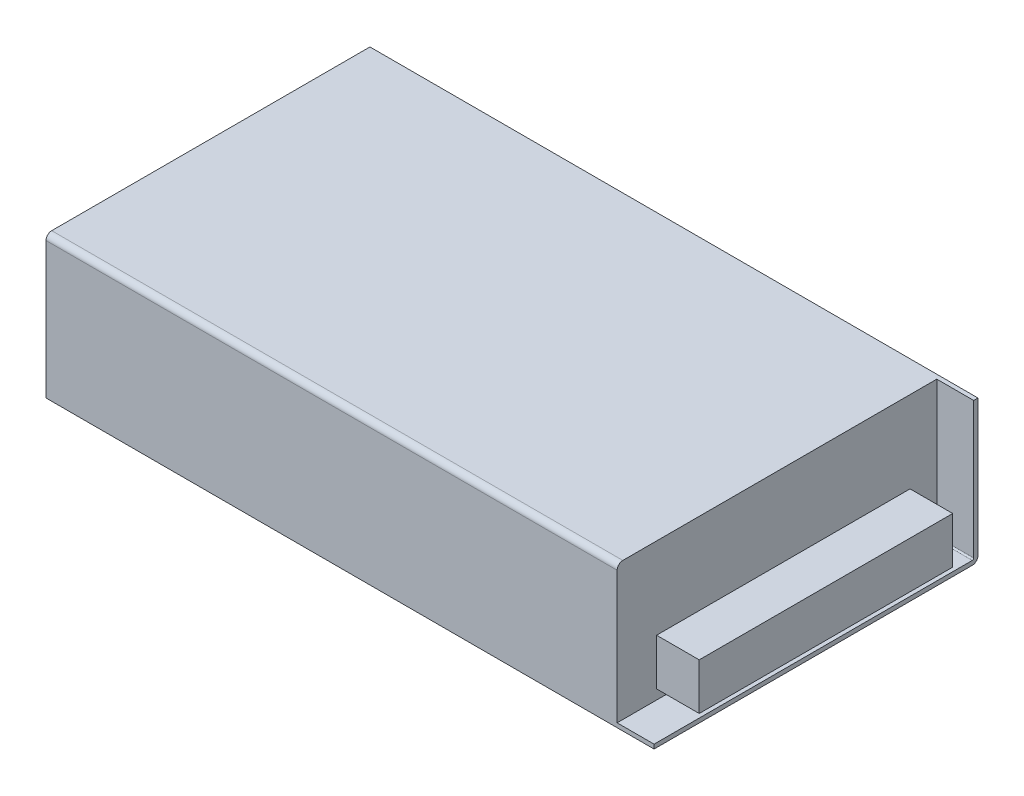
ISO-10303-21;
HEADER;
FILE_DESCRIPTION(('STEP AP214'),'2;1');
FILE_NAME('part.step','',(''),(''),'','','');
FILE_SCHEMA(('AUTOMOTIVE_DESIGN { 1 0 10303 214 1 1 1 1 }'));
ENDSEC;
DATA;
#1=APPLICATION_CONTEXT('core data for automotive mechanical design processes');
#2=APPLICATION_PROTOCOL_DEFINITION('international standard','automotive_design',2000,#1);
#3=PRODUCT_CONTEXT('',#1,'mechanical');
#4=PRODUCT('Part','Part','',(#3));
#5=PRODUCT_RELATED_PRODUCT_CATEGORY('part','',(#4));
#6=PRODUCT_DEFINITION_FORMATION('','',#4);
#7=PRODUCT_DEFINITION_CONTEXT('part definition',#1,'design');
#8=PRODUCT_DEFINITION('design','',#6,#7);
#9=PRODUCT_DEFINITION_SHAPE('','',#8);
#10=(LENGTH_UNIT() NAMED_UNIT(*) SI_UNIT(.MILLI.,.METRE.));
#11=(NAMED_UNIT(*) PLANE_ANGLE_UNIT() SI_UNIT($,.RADIAN.));
#12=(NAMED_UNIT(*) SI_UNIT($,.STERADIAN.) SOLID_ANGLE_UNIT());
#13=UNCERTAINTY_MEASURE_WITH_UNIT(LENGTH_MEASURE(1.E-05),#10,'distance_accuracy_value','');
#14=(GEOMETRIC_REPRESENTATION_CONTEXT(3) GLOBAL_UNCERTAINTY_ASSIGNED_CONTEXT((#13)) GLOBAL_UNIT_ASSIGNED_CONTEXT((#10,
#11,#12)) REPRESENTATION_CONTEXT('',''));
#15=CARTESIAN_POINT('',(0.,0.,0.));
#16=DIRECTION('',(0.,0.,1.));
#17=DIRECTION('',(1.,0.,0.));
#18=AXIS2_PLACEMENT_3D('',#15,#16,#17);
#19=CARTESIAN_POINT('',(94.,0.,0.));
#20=DIRECTION('',(1.,0.,0.));
#21=DIRECTION('',(0.,0.,-1.));
#22=AXIS2_PLACEMENT_3D('',#19,#20,#21);
#23=PLANE('',#22);
#24=DIRECTION('',(0.,0.,1.));
#25=VECTOR('',#24,1.);
#26=CARTESIAN_POINT('',(94.,50.,57.));
#27=LINE('',#26,#25);
#28=CARTESIAN_POINT('',(94.,50.,-55.5));
#29=VERTEX_POINT('',#28);
#30=CARTESIAN_POINT('',(94.,50.,55.));
#31=VERTEX_POINT('',#30);
#32=EDGE_CURVE('E196',#29,#31,#27,.T.);
#33=ORIENTED_EDGE('',*,*,#32,.T.);
#34=CARTESIAN_POINT('',(94.,48.,55.));
#35=DIRECTION('',(1.,0.,0.));
#36=DIRECTION('',(0.,0.,-1.));
#37=AXIS2_PLACEMENT_3D('',#34,#35,#36);
#38=CIRCLE('',#37,2.);
#39=CARTESIAN_POINT('',(94.,48.,57.));
#40=VERTEX_POINT('',#39);
#41=EDGE_CURVE('E25',#31,#40,#38,.T.);
#42=ORIENTED_EDGE('',*,*,#41,.T.);
#43=DIRECTION('',(0.,-1.,0.));
#44=VECTOR('',#43,1.);
#45=CARTESIAN_POINT('',(94.,50.,57.));
#46=LINE('',#45,#44);
#47=CARTESIAN_POINT('',(94.,1.5,57.));
#48=VERTEX_POINT('',#47);
#49=EDGE_CURVE('E188',#40,#48,#46,.T.);
#50=ORIENTED_EDGE('',*,*,#49,.T.);
#51=DIRECTION('',(0.,0.,-1.));
#52=VECTOR('',#51,1.);
#53=CARTESIAN_POINT('',(94.,1.5,57.));
#54=LINE('',#53,#52);
#55=CARTESIAN_POINT('',(94.,1.5,-55.));
#56=VERTEX_POINT('',#55);
#57=EDGE_CURVE('E190',#48,#56,#54,.T.);
#58=ORIENTED_EDGE('',*,*,#57,.T.);
#59=CARTESIAN_POINT('',(94.,2.,-55.));
#60=DIRECTION('',(1.,0.,0.));
#61=DIRECTION('',(0.,0.,-1.));
#62=AXIS2_PLACEMENT_3D('',#59,#60,#61);
#63=CIRCLE('',#62,0.5);
#64=CARTESIAN_POINT('',(94.,2.,-55.5));
#65=VERTEX_POINT('',#64);
#66=EDGE_CURVE('E237',#56,#65,#63,.T.);
#67=ORIENTED_EDGE('',*,*,#66,.T.);
#68=DIRECTION('',(0.,1.,0.));
#69=VECTOR('',#68,1.);
#70=CARTESIAN_POINT('',(94.,50.,-55.5));
#71=LINE('',#70,#69);
#72=EDGE_CURVE('E194',#65,#29,#71,.T.);
#73=ORIENTED_EDGE('',*,*,#72,.T.);
#74=EDGE_LOOP('',(#33,#42,#50,#58,#67,#73));
#75=FACE_BOUND('',#74,.T.);
#76=DIRECTION('',(0.,0.,-1.));
#77=VECTOR('',#76,1.);
#78=CARTESIAN_POINT('',(94.,4.89638068839784,43.1119440750721));
#79=LINE('',#78,#77);
#80=CARTESIAN_POINT('',(94.,4.89638068839784,43.1119440750721));
#81=VERTEX_POINT('',#80);
#82=CARTESIAN_POINT('',(94.,4.89638068839784,-46.093089144093));
#83=VERTEX_POINT('',#82);
#84=EDGE_CURVE('E174',#81,#83,#79,.T.);
#85=ORIENTED_EDGE('',*,*,#84,.F.);
#86=DIRECTION('',(0.,-1.,0.));
#87=VECTOR('',#86,1.);
#88=CARTESIAN_POINT('',(94.,21.2544587594359,43.1119440750721));
#89=LINE('',#88,#87);
#90=CARTESIAN_POINT('',(94.,21.2544587594359,43.1119440750721));
#91=VERTEX_POINT('',#90);
#92=EDGE_CURVE('E160',#91,#81,#89,.T.);
#93=ORIENTED_EDGE('',*,*,#92,.F.);
#94=DIRECTION('',(0.,0.,1.));
#95=VECTOR('',#94,1.);
#96=CARTESIAN_POINT('',(94.,21.2544587594359,43.1119440750721));
#97=LINE('',#96,#95);
#98=CARTESIAN_POINT('',(94.,21.2544587594359,-46.093089144093));
#99=VERTEX_POINT('',#98);
#100=EDGE_CURVE('E165',#99,#91,#97,.T.);
#101=ORIENTED_EDGE('',*,*,#100,.F.);
#102=DIRECTION('',(0.,1.,0.));
#103=VECTOR('',#102,1.);
#104=CARTESIAN_POINT('',(94.,21.2544587594359,-46.093089144093));
#105=LINE('',#104,#103);
#106=EDGE_CURVE('E176',#83,#99,#105,.T.);
#107=ORIENTED_EDGE('',*,*,#106,.F.);
#108=EDGE_LOOP('',(#85,#93,#101,#107));
#109=FACE_BOUND('',#108,.T.);
#110=ADVANCED_FACE('F17',(#75,#109),#23,.T.);
#111=CARTESIAN_POINT('',(-107.,50.,57.));
#112=DIRECTION('',(1.,0.,0.));
#113=DIRECTION('',(0.,0.,-1.));
#114=AXIS2_PLACEMENT_3D('',#111,#112,#113);
#115=PLANE('',#114);
#116=DIRECTION('',(0.,-1.,0.));
#117=VECTOR('',#116,1.);
#118=CARTESIAN_POINT('',(-107.,50.,-57.));
#119=LINE('',#118,#117);
#120=CARTESIAN_POINT('',(-107.,50.,-57.));
#121=VERTEX_POINT('',#120);
#122=CARTESIAN_POINT('',(-107.,2.,-57.));
#123=VERTEX_POINT('',#122);
#124=EDGE_CURVE('E215',#121,#123,#119,.T.);
#125=ORIENTED_EDGE('',*,*,#124,.T.);
#126=CARTESIAN_POINT('',(-107.,2.,-55.));
#127=DIRECTION('',(1.,0.,0.));
#128=DIRECTION('',(0.,0.,-1.));
#129=AXIS2_PLACEMENT_3D('',#126,#127,#128);
#130=CIRCLE('',#129,2.);
#131=CARTESIAN_POINT('',(-107.,0.,-55.));
#132=VERTEX_POINT('',#131);
#133=EDGE_CURVE('E246',#123,#132,#130,.F.);
#134=ORIENTED_EDGE('',*,*,#133,.T.);
#135=DIRECTION('',(0.,0.,1.));
#136=VECTOR('',#135,1.);
#137=CARTESIAN_POINT('',(-107.,0.,57.));
#138=LINE('',#137,#136);
#139=CARTESIAN_POINT('',(-107.,0.,57.));
#140=VERTEX_POINT('',#139);
#141=EDGE_CURVE('E205',#132,#140,#138,.T.);
#142=ORIENTED_EDGE('',*,*,#141,.T.);
#143=DIRECTION('',(0.,-1.,0.));
#144=VECTOR('',#143,1.);
#145=CARTESIAN_POINT('',(-107.,50.,57.));
#146=LINE('',#145,#144);
#147=CARTESIAN_POINT('',(-107.,48.,57.));
#148=VERTEX_POINT('',#147);
#149=EDGE_CURVE('E230',#148,#140,#146,.T.);
#150=ORIENTED_EDGE('',*,*,#149,.F.);
#151=CARTESIAN_POINT('',(-107.,48.,55.));
#152=DIRECTION('',(1.,0.,0.));
#153=DIRECTION('',(0.,0.,-1.));
#154=AXIS2_PLACEMENT_3D('',#151,#152,#153);
#155=CIRCLE('',#154,2.);
#156=CARTESIAN_POINT('',(-107.,50.,55.));
#157=VERTEX_POINT('',#156);
#158=EDGE_CURVE('E244',#148,#157,#155,.F.);
#159=ORIENTED_EDGE('',*,*,#158,.T.);
#160=DIRECTION('',(0.,0.,1.));
#161=VECTOR('',#160,1.);
#162=CARTESIAN_POINT('',(-107.,50.,57.));
#163=LINE('',#162,#161);
#164=EDGE_CURVE('E207',#121,#157,#163,.T.);
#165=ORIENTED_EDGE('',*,*,#164,.F.);
#166=EDGE_LOOP('',(#125,#134,#142,#150,#159,#165));
#167=FACE_BOUND('',#166,.T.);
#168=ADVANCED_FACE('F280',(#167),#115,.F.);
#169=CARTESIAN_POINT('',(107.,50.,57.));
#170=DIRECTION('',(0.,0.,-1.));
#171=DIRECTION('',(-1.,0.,0.));
#172=AXIS2_PLACEMENT_3D('',#169,#170,#171);
#173=PLANE('',#172);
#174=ORIENTED_EDGE('',*,*,#49,.F.);
#175=DIRECTION('',(1.,0.,0.));
#176=VECTOR('',#175,1.);
#177=CARTESIAN_POINT('',(-107.,48.,57.));
#178=LINE('',#177,#176);
#179=EDGE_CURVE('E11',#40,#148,#178,.F.);
#180=ORIENTED_EDGE('',*,*,#179,.T.);
#181=ORIENTED_EDGE('',*,*,#149,.T.);
#182=DIRECTION('',(1.,0.,0.));
#183=VECTOR('',#182,1.);
#184=CARTESIAN_POINT('',(107.,0.,57.));
#185=LINE('',#184,#183);
#186=CARTESIAN_POINT('',(107.,0.,57.));
#187=VERTEX_POINT('',#186);
#188=EDGE_CURVE('E218',#140,#187,#185,.T.);
#189=ORIENTED_EDGE('',*,*,#188,.T.);
#190=DIRECTION('',(0.,-1.,0.));
#191=VECTOR('',#190,1.);
#192=CARTESIAN_POINT('',(107.,50.,57.));
#193=LINE('',#192,#191);
#194=CARTESIAN_POINT('',(107.,1.5,57.));
#195=VERTEX_POINT('',#194);
#196=EDGE_CURVE('E228',#195,#187,#193,.T.);
#197=ORIENTED_EDGE('',*,*,#196,.F.);
#198=DIRECTION('',(1.,0.,0.));
#199=VECTOR('',#198,1.);
#200=CARTESIAN_POINT('',(94.,1.5,57.));
#201=LINE('',#200,#199);
#202=EDGE_CURVE('E198',#48,#195,#201,.T.);
#203=ORIENTED_EDGE('',*,*,#202,.F.);
#204=EDGE_LOOP('',(#174,#180,#181,#189,#197,#203));
#205=FACE_BOUND('',#204,.T.);
#206=ADVANCED_FACE('F284',(#205),#173,.F.);
#207=CARTESIAN_POINT('',(107.,50.,57.));
#208=DIRECTION('',(-1.,0.,0.));
#209=DIRECTION('',(0.,0.,1.));
#210=AXIS2_PLACEMENT_3D('',#207,#208,#209);
#211=PLANE('',#210);
#212=DIRECTION('',(0.,0.,-1.));
#213=VECTOR('',#212,1.);
#214=CARTESIAN_POINT('',(107.,0.,57.));
#215=LINE('',#214,#213);
#216=CARTESIAN_POINT('',(107.,0.,-55.));
#217=VERTEX_POINT('',#216);
#218=EDGE_CURVE('E211',#187,#217,#215,.T.);
#219=ORIENTED_EDGE('',*,*,#218,.T.);
#220=CARTESIAN_POINT('',(107.,2.,-55.));
#221=DIRECTION('',(-1.,0.,0.));
#222=DIRECTION('',(0.,0.,1.));
#223=AXIS2_PLACEMENT_3D('',#220,#221,#222);
#224=CIRCLE('',#223,2.);
#225=CARTESIAN_POINT('',(107.,2.,-57.));
#226=VERTEX_POINT('',#225);
#227=EDGE_CURVE('E250',#217,#226,#224,.F.);
#228=ORIENTED_EDGE('',*,*,#227,.T.);
#229=DIRECTION('',(0.,-1.,0.));
#230=VECTOR('',#229,1.);
#231=CARTESIAN_POINT('',(107.,50.,-57.));
#232=LINE('',#231,#230);
#233=CARTESIAN_POINT('',(107.,50.,-57.));
#234=VERTEX_POINT('',#233);
#235=EDGE_CURVE('E225',#234,#226,#232,.T.);
#236=ORIENTED_EDGE('',*,*,#235,.F.);
#237=DIRECTION('',(0.,0.,-1.));
#238=VECTOR('',#237,1.);
#239=CARTESIAN_POINT('',(107.,50.,57.));
#240=LINE('',#239,#238);
#241=CARTESIAN_POINT('',(107.,50.,-55.5));
#242=VERTEX_POINT('',#241);
#243=EDGE_CURVE('E210',#242,#234,#240,.T.);
#244=ORIENTED_EDGE('',*,*,#243,.F.);
#245=DIRECTION('',(0.,1.,0.));
#246=VECTOR('',#245,1.);
#247=CARTESIAN_POINT('',(107.,50.,-55.5));
#248=LINE('',#247,#246);
#249=CARTESIAN_POINT('',(107.,2.,-55.5));
#250=VERTEX_POINT('',#249);
#251=EDGE_CURVE('E191',#250,#242,#248,.T.);
#252=ORIENTED_EDGE('',*,*,#251,.F.);
#253=CARTESIAN_POINT('',(107.,2.,-55.));
#254=DIRECTION('',(-1.,0.,0.));
#255=DIRECTION('',(0.,0.,1.));
#256=AXIS2_PLACEMENT_3D('',#253,#254,#255);
#257=CIRCLE('',#256,0.5);
#258=CARTESIAN_POINT('',(107.,1.5,-55.));
#259=VERTEX_POINT('',#258);
#260=EDGE_CURVE('E239',#250,#259,#257,.T.);
#261=ORIENTED_EDGE('',*,*,#260,.T.);
#262=DIRECTION('',(0.,0.,-1.));
#263=VECTOR('',#262,1.);
#264=CARTESIAN_POINT('',(107.,1.5,57.));
#265=LINE('',#264,#263);
#266=EDGE_CURVE('E187',#195,#259,#265,.T.);
#267=ORIENTED_EDGE('',*,*,#266,.F.);
#268=ORIENTED_EDGE('',*,*,#196,.T.);
#269=EDGE_LOOP('',(#219,#228,#236,#244,#252,#261,#267,#268));
#270=FACE_BOUND('',#269,.T.);
#271=ADVANCED_FACE('F272',(#270),#211,.F.);
#272=CARTESIAN_POINT('',(107.,50.,-57.));
#273=DIRECTION('',(0.,0.,1.));
#274=DIRECTION('',(1.,0.,0.));
#275=AXIS2_PLACEMENT_3D('',#272,#273,#274);
#276=PLANE('',#275);
#277=ORIENTED_EDGE('',*,*,#235,.T.);
#278=DIRECTION('',(-1.,0.,0.));
#279=VECTOR('',#278,1.);
#280=CARTESIAN_POINT('',(107.,2.,-57.));
#281=LINE('',#280,#279);
#282=EDGE_CURVE('E241',#226,#123,#281,.T.);
#283=ORIENTED_EDGE('',*,*,#282,.T.);
#284=ORIENTED_EDGE('',*,*,#124,.F.);
#285=DIRECTION('',(-1.,0.,0.));
#286=VECTOR('',#285,1.);
#287=CARTESIAN_POINT('',(107.,50.,-57.));
#288=LINE('',#287,#286);
#289=EDGE_CURVE('E213',#234,#121,#288,.T.);
#290=ORIENTED_EDGE('',*,*,#289,.F.);
#291=EDGE_LOOP('',(#277,#283,#284,#290));
#292=FACE_BOUND('',#291,.T.);
#293=ADVANCED_FACE('F278',(#292),#276,.F.);
#294=CARTESIAN_POINT('',(0.,50.,0.));
#295=DIRECTION('',(0.,1.,0.));
#296=DIRECTION('',(0.,0.,1.));
#297=AXIS2_PLACEMENT_3D('',#294,#295,#296);
#298=PLANE('',#297);
#299=ORIENTED_EDGE('',*,*,#164,.T.);
#300=DIRECTION('',(1.,0.,0.));
#301=VECTOR('',#300,1.);
#302=CARTESIAN_POINT('',(94.,50.,55.));
#303=LINE('',#302,#301);
#304=EDGE_CURVE('E252',#157,#31,#303,.T.);
#305=ORIENTED_EDGE('',*,*,#304,.T.);
#306=ORIENTED_EDGE('',*,*,#32,.F.);
#307=DIRECTION('',(1.,0.,0.));
#308=VECTOR('',#307,1.);
#309=CARTESIAN_POINT('',(94.,50.,-55.5));
#310=LINE('',#309,#308);
#311=EDGE_CURVE('E202',#29,#242,#310,.T.);
#312=ORIENTED_EDGE('',*,*,#311,.T.);
#313=ORIENTED_EDGE('',*,*,#243,.T.);
#314=ORIENTED_EDGE('',*,*,#289,.T.);
#315=EDGE_LOOP('',(#299,#305,#306,#312,#313,#314));
#316=FACE_BOUND('',#315,.T.);
#317=ADVANCED_FACE('F257',(#316),#298,.T.);
#318=CARTESIAN_POINT('',(0.,0.,0.));
#319=DIRECTION('',(0.,1.,0.));
#320=DIRECTION('',(0.,0.,1.));
#321=AXIS2_PLACEMENT_3D('',#318,#319,#320);
#322=PLANE('',#321);
#323=CARTESIAN_POINT('',(-75.,0.,-25.));
#324=DIRECTION('',(0.,-1.,0.));
#325=DIRECTION('',(0.,0.,-1.));
#326=AXIS2_PLACEMENT_3D('',#323,#324,#325);
#327=CIRCLE('',#326,1.65);
#328=CARTESIAN_POINT('',(-75.,0.,-26.65));
#329=VERTEX_POINT('',#328);
#330=EDGE_CURVE('E138',#329,#329,#327,.T.);
#331=ORIENTED_EDGE('',*,*,#330,.F.);
#332=EDGE_LOOP('',(#331));
#333=FACE_BOUND('',#332,.T.);
#334=CARTESIAN_POINT('',(-75.,0.,25.));
#335=DIRECTION('',(0.,-1.,0.));
#336=DIRECTION('',(0.,0.,-1.));
#337=AXIS2_PLACEMENT_3D('',#334,#335,#336);
#338=CIRCLE('',#337,1.65);
#339=CARTESIAN_POINT('',(-75.,0.,23.35));
#340=VERTEX_POINT('',#339);
#341=EDGE_CURVE('E137',#340,#340,#338,.T.);
#342=ORIENTED_EDGE('',*,*,#341,.F.);
#343=EDGE_LOOP('',(#342));
#344=FACE_BOUND('',#343,.T.);
#345=CARTESIAN_POINT('',(75.,0.,-25.));
#346=DIRECTION('',(0.,-1.,0.));
#347=DIRECTION('',(0.,0.,-1.));
#348=AXIS2_PLACEMENT_3D('',#345,#346,#347);
#349=CIRCLE('',#348,1.65);
#350=CARTESIAN_POINT('',(75.,0.,-26.65));
#351=VERTEX_POINT('',#350);
#352=EDGE_CURVE('E148',#351,#351,#349,.T.);
#353=ORIENTED_EDGE('',*,*,#352,.F.);
#354=EDGE_LOOP('',(#353));
#355=FACE_BOUND('',#354,.T.);
#356=CARTESIAN_POINT('',(75.,0.,25.));
#357=DIRECTION('',(0.,-1.,0.));
#358=DIRECTION('',(0.,0.,-1.));
#359=AXIS2_PLACEMENT_3D('',#356,#357,#358);
#360=CIRCLE('',#359,1.65);
#361=CARTESIAN_POINT('',(75.,0.,23.35));
#362=VERTEX_POINT('',#361);
#363=EDGE_CURVE('E154',#362,#362,#360,.T.);
#364=ORIENTED_EDGE('',*,*,#363,.F.);
#365=EDGE_LOOP('',(#364));
#366=FACE_BOUND('',#365,.T.);
#367=ORIENTED_EDGE('',*,*,#141,.F.);
#368=DIRECTION('',(-1.,0.,0.));
#369=VECTOR('',#368,1.);
#370=CARTESIAN_POINT('',(0.,0.,-55.));
#371=LINE('',#370,#369);
#372=EDGE_CURVE('E248',#132,#217,#371,.F.);
#373=ORIENTED_EDGE('',*,*,#372,.T.);
#374=ORIENTED_EDGE('',*,*,#218,.F.);
#375=ORIENTED_EDGE('',*,*,#188,.F.);
#376=EDGE_LOOP('',(#367,#373,#374,#375));
#377=FACE_BOUND('',#376,.T.);
#378=ADVANCED_FACE('F298',(#333,#344,#355,#366,#377),#322,.F.);
#379=CARTESIAN_POINT('',(94.,50.,-55.5));
#380=DIRECTION('',(0.,0.,-1.));
#381=DIRECTION('',(-1.,0.,0.));
#382=AXIS2_PLACEMENT_3D('',#379,#380,#381);
#383=PLANE('',#382);
#384=ORIENTED_EDGE('',*,*,#72,.F.);
#385=DIRECTION('',(1.,0.,0.));
#386=VECTOR('',#385,1.);
#387=CARTESIAN_POINT('',(107.,2.,-55.5));
#388=LINE('',#387,#386);
#389=EDGE_CURVE('E232',#65,#250,#388,.T.);
#390=ORIENTED_EDGE('',*,*,#389,.T.);
#391=ORIENTED_EDGE('',*,*,#251,.T.);
#392=ORIENTED_EDGE('',*,*,#311,.F.);
#393=EDGE_LOOP('',(#384,#390,#391,#392));
#394=FACE_BOUND('',#393,.T.);
#395=ADVANCED_FACE('F267',(#394),#383,.F.);
#396=CARTESIAN_POINT('',(94.,1.5,57.));
#397=DIRECTION('',(0.,-1.,0.));
#398=DIRECTION('',(0.,0.,-1.));
#399=AXIS2_PLACEMENT_3D('',#396,#397,#398);
#400=PLANE('',#399);
#401=ORIENTED_EDGE('',*,*,#266,.T.);
#402=DIRECTION('',(1.,0.,0.));
#403=VECTOR('',#402,1.);
#404=CARTESIAN_POINT('',(94.,1.5,-55.));
#405=LINE('',#404,#403);
#406=EDGE_CURVE('E235',#259,#56,#405,.F.);
#407=ORIENTED_EDGE('',*,*,#406,.T.);
#408=ORIENTED_EDGE('',*,*,#57,.F.);
#409=ORIENTED_EDGE('',*,*,#202,.T.);
#410=EDGE_LOOP('',(#401,#407,#408,#409));
#411=FACE_BOUND('',#410,.T.);
#412=ADVANCED_FACE('F289',(#411),#400,.F.);
#413=CARTESIAN_POINT('',(94.,2.,-55.));
#414=DIRECTION('',(-1.,0.,0.));
#415=DIRECTION('',(0.,0.,1.));
#416=AXIS2_PLACEMENT_3D('',#413,#414,#415);
#417=CYLINDRICAL_SURFACE('',#416,0.5);
#418=ORIENTED_EDGE('',*,*,#66,.F.);
#419=ORIENTED_EDGE('',*,*,#406,.F.);
#420=ORIENTED_EDGE('',*,*,#260,.F.);
#421=ORIENTED_EDGE('',*,*,#389,.F.);
#422=EDGE_LOOP('',(#418,#419,#420,#421));
#423=FACE_BOUND('',#422,.T.);
#424=ADVANCED_FACE('F293',(#423),#417,.F.);
#425=CARTESIAN_POINT('',(107.,2.,-55.));
#426=DIRECTION('',(-1.,0.,0.));
#427=DIRECTION('',(0.,0.,1.));
#428=AXIS2_PLACEMENT_3D('',#425,#426,#427);
#429=CYLINDRICAL_SURFACE('',#428,2.);
#430=ORIENTED_EDGE('',*,*,#227,.F.);
#431=ORIENTED_EDGE('',*,*,#372,.F.);
#432=ORIENTED_EDGE('',*,*,#133,.F.);
#433=ORIENTED_EDGE('',*,*,#282,.F.);
#434=EDGE_LOOP('',(#430,#431,#432,#433));
#435=FACE_BOUND('',#434,.T.);
#436=ADVANCED_FACE('F301',(#435),#429,.T.);
#437=CARTESIAN_POINT('',(0.,48.,55.));
#438=DIRECTION('',(-1.,0.,0.));
#439=DIRECTION('',(0.,0.,1.));
#440=AXIS2_PLACEMENT_3D('',#437,#438,#439);
#441=CYLINDRICAL_SURFACE('',#440,2.);
#442=ORIENTED_EDGE('',*,*,#158,.F.);
#443=ORIENTED_EDGE('',*,*,#179,.F.);
#444=ORIENTED_EDGE('',*,*,#41,.F.);
#445=ORIENTED_EDGE('',*,*,#304,.F.);
#446=EDGE_LOOP('',(#442,#443,#444,#445));
#447=FACE_BOUND('',#446,.T.);
#448=ADVANCED_FACE('F19',(#447),#441,.T.);
#449=CARTESIAN_POINT('',(109.,21.2544587594359,43.1119440750721));
#450=DIRECTION('',(0.,0.,-1.));
#451=DIRECTION('',(-1.,0.,0.));
#452=AXIS2_PLACEMENT_3D('',#449,#450,#451);
#453=PLANE('',#452);
#454=ORIENTED_EDGE('',*,*,#92,.T.);
#455=DIRECTION('',(-1.,0.,0.));
#456=VECTOR('',#455,1.);
#457=CARTESIAN_POINT('',(109.,4.89638068839784,43.1119440750721));
#458=LINE('',#457,#456);
#459=CARTESIAN_POINT('',(109.,4.89638068839784,43.1119440750721));
#460=VERTEX_POINT('',#459);
#461=EDGE_CURVE('E185',#460,#81,#458,.T.);
#462=ORIENTED_EDGE('',*,*,#461,.F.);
#463=DIRECTION('',(0.,-1.,0.));
#464=VECTOR('',#463,1.);
#465=CARTESIAN_POINT('',(109.,21.2544587594359,43.1119440750721));
#466=LINE('',#465,#464);
#467=CARTESIAN_POINT('',(109.,21.2544587594359,43.1119440750721));
#468=VERTEX_POINT('',#467);
#469=EDGE_CURVE('E161',#468,#460,#466,.T.);
#470=ORIENTED_EDGE('',*,*,#469,.F.);
#471=DIRECTION('',(-1.,0.,0.));
#472=VECTOR('',#471,1.);
#473=CARTESIAN_POINT('',(109.,21.2544587594359,43.1119440750721));
#474=LINE('',#473,#472);
#475=EDGE_CURVE('E171',#468,#91,#474,.T.);
#476=ORIENTED_EDGE('',*,*,#475,.T.);
#477=EDGE_LOOP('',(#454,#462,#470,#476));
#478=FACE_BOUND('',#477,.T.);
#479=ADVANCED_FACE('F309',(#478),#453,.F.);
#480=CARTESIAN_POINT('',(109.,4.89638068839784,43.1119440750721));
#481=DIRECTION('',(0.,1.,0.));
#482=DIRECTION('',(-1.,0.,0.));
#483=AXIS2_PLACEMENT_3D('',#480,#481,#482);
#484=PLANE('',#483);
#485=ORIENTED_EDGE('',*,*,#84,.T.);
#486=DIRECTION('',(-1.,0.,0.));
#487=VECTOR('',#486,1.);
#488=CARTESIAN_POINT('',(109.,4.89638068839784,-46.093089144093));
#489=LINE('',#488,#487);
#490=CARTESIAN_POINT('',(109.,4.89638068839784,-46.093089144093));
#491=VERTEX_POINT('',#490);
#492=EDGE_CURVE('E182',#491,#83,#489,.T.);
#493=ORIENTED_EDGE('',*,*,#492,.F.);
#494=DIRECTION('',(0.,0.,-1.));
#495=VECTOR('',#494,1.);
#496=CARTESIAN_POINT('',(109.,4.89638068839784,43.1119440750721));
#497=LINE('',#496,#495);
#498=EDGE_CURVE('E164',#460,#491,#497,.T.);
#499=ORIENTED_EDGE('',*,*,#498,.F.);
#500=ORIENTED_EDGE('',*,*,#461,.T.);
#501=EDGE_LOOP('',(#485,#493,#499,#500));
#502=FACE_BOUND('',#501,.T.);
#503=ADVANCED_FACE('F400',(#502),#484,.F.);
#504=CARTESIAN_POINT('',(109.,21.2544587594359,-46.093089144093));
#505=DIRECTION('',(0.,0.,1.));
#506=DIRECTION('',(1.,0.,0.));
#507=AXIS2_PLACEMENT_3D('',#504,#505,#506);
#508=PLANE('',#507);
#509=ORIENTED_EDGE('',*,*,#106,.T.);
#510=DIRECTION('',(-1.,0.,0.));
#511=VECTOR('',#510,1.);
#512=CARTESIAN_POINT('',(109.,21.2544587594359,-46.093089144093));
#513=LINE('',#512,#511);
#514=CARTESIAN_POINT('',(109.,21.2544587594359,-46.093089144093));
#515=VERTEX_POINT('',#514);
#516=EDGE_CURVE('E32',#515,#99,#513,.T.);
#517=ORIENTED_EDGE('',*,*,#516,.F.);
#518=DIRECTION('',(0.,1.,0.));
#519=VECTOR('',#518,1.);
#520=CARTESIAN_POINT('',(109.,21.2544587594359,-46.093089144093));
#521=LINE('',#520,#519);
#522=EDGE_CURVE('E167',#491,#515,#521,.T.);
#523=ORIENTED_EDGE('',*,*,#522,.F.);
#524=ORIENTED_EDGE('',*,*,#492,.T.);
#525=EDGE_LOOP('',(#509,#517,#523,#524));
#526=FACE_BOUND('',#525,.T.);
#527=ADVANCED_FACE('F409',(#526),#508,.F.);
#528=CARTESIAN_POINT('',(109.,21.2544587594359,43.1119440750721));
#529=DIRECTION('',(0.,-1.,0.));
#530=DIRECTION('',(1.,0.,0.));
#531=AXIS2_PLACEMENT_3D('',#528,#529,#530);
#532=PLANE('',#531);
#533=ORIENTED_EDGE('',*,*,#100,.T.);
#534=ORIENTED_EDGE('',*,*,#475,.F.);
#535=DIRECTION('',(0.,0.,1.));
#536=VECTOR('',#535,1.);
#537=CARTESIAN_POINT('',(109.,21.2544587594359,43.1119440750721));
#538=LINE('',#537,#536);
#539=EDGE_CURVE('E169',#515,#468,#538,.T.);
#540=ORIENTED_EDGE('',*,*,#539,.F.);
#541=ORIENTED_EDGE('',*,*,#516,.T.);
#542=EDGE_LOOP('',(#533,#534,#540,#541));
#543=FACE_BOUND('',#542,.T.);
#544=ADVANCED_FACE('F418',(#543),#532,.F.);
#545=CARTESIAN_POINT('',(109.,0.,0.));
#546=DIRECTION('',(1.,0.,0.));
#547=DIRECTION('',(0.,0.,-1.));
#548=AXIS2_PLACEMENT_3D('',#545,#546,#547);
#549=PLANE('',#548);
#550=ORIENTED_EDGE('',*,*,#469,.T.);
#551=ORIENTED_EDGE('',*,*,#498,.T.);
#552=ORIENTED_EDGE('',*,*,#522,.T.);
#553=ORIENTED_EDGE('',*,*,#539,.T.);
#554=EDGE_LOOP('',(#550,#551,#552,#553));
#555=FACE_BOUND('',#554,.T.);
#556=ADVANCED_FACE('F428',(#555),#549,.T.);
#557=CARTESIAN_POINT('',(75.,11.5,25.));
#558=DIRECTION('',(0.,-1.,0.));
#559=DIRECTION('',(0.,0.,-1.));
#560=AXIS2_PLACEMENT_3D('',#557,#558,#559);
#561=CONICAL_SURFACE('',#560,1.65,1.02974425867665);
#562=CARTESIAN_POINT('',(75.,12.4914200213955,25.));
#563=VERTEX_POINT('',#562);
#564=VERTEX_LOOP('',#563);
#565=FACE_BOUND('',#564,.T.);
#566=CARTESIAN_POINT('',(75.,11.5,25.));
#567=DIRECTION('',(0.,-1.,0.));
#568=DIRECTION('',(0.,0.,-1.));
#569=AXIS2_PLACEMENT_3D('',#566,#567,#568);
#570=CIRCLE('',#569,1.65);
#571=CARTESIAN_POINT('',(75.,11.5,23.35));
#572=VERTEX_POINT('',#571);
#573=EDGE_CURVE('E157',#572,#572,#570,.T.);
#574=ORIENTED_EDGE('',*,*,#573,.T.);
#575=EDGE_LOOP('',(#574));
#576=FACE_BOUND('',#575,.T.);
#577=ADVANCED_FACE('F437',(#565,#576),#561,.F.);
#578=CARTESIAN_POINT('',(75.,0.,25.));
#579=DIRECTION('',(0.,-1.,0.));
#580=DIRECTION('',(0.,0.,-1.));
#581=AXIS2_PLACEMENT_3D('',#578,#579,#580);
#582=CYLINDRICAL_SURFACE('',#581,1.65);
#583=ORIENTED_EDGE('',*,*,#573,.F.);
#584=EDGE_LOOP('',(#583));
#585=FACE_BOUND('',#584,.T.);
#586=ORIENTED_EDGE('',*,*,#363,.T.);
#587=EDGE_LOOP('',(#586));
#588=FACE_BOUND('',#587,.T.);
#589=ADVANCED_FACE('F447',(#585,#588),#582,.F.);
#590=CARTESIAN_POINT('',(75.,11.5,-25.));
#591=DIRECTION('',(0.,-1.,0.));
#592=DIRECTION('',(0.,0.,-1.));
#593=AXIS2_PLACEMENT_3D('',#590,#591,#592);
#594=CONICAL_SURFACE('',#593,1.65,1.02974425867665);
#595=CARTESIAN_POINT('',(75.,12.4914200213955,-25.));
#596=VERTEX_POINT('',#595);
#597=VERTEX_LOOP('',#596);
#598=FACE_BOUND('',#597,.T.);
#599=CARTESIAN_POINT('',(75.,11.5,-25.));
#600=DIRECTION('',(0.,-1.,0.));
#601=DIRECTION('',(0.,0.,-1.));
#602=AXIS2_PLACEMENT_3D('',#599,#600,#601);
#603=CIRCLE('',#602,1.65);
#604=CARTESIAN_POINT('',(75.,11.5,-26.65));
#605=VERTEX_POINT('',#604);
#606=EDGE_CURVE('E151',#605,#605,#603,.T.);
#607=ORIENTED_EDGE('',*,*,#606,.T.);
#608=EDGE_LOOP('',(#607));
#609=FACE_BOUND('',#608,.T.);
#610=ADVANCED_FACE('F457',(#598,#609),#594,.F.);
#611=CARTESIAN_POINT('',(75.,0.,-25.));
#612=DIRECTION('',(0.,-1.,0.));
#613=DIRECTION('',(0.,0.,-1.));
#614=AXIS2_PLACEMENT_3D('',#611,#612,#613);
#615=CYLINDRICAL_SURFACE('',#614,1.65);
#616=ORIENTED_EDGE('',*,*,#606,.F.);
#617=EDGE_LOOP('',(#616));
#618=FACE_BOUND('',#617,.T.);
#619=ORIENTED_EDGE('',*,*,#352,.T.);
#620=EDGE_LOOP('',(#619));
#621=FACE_BOUND('',#620,.T.);
#622=ADVANCED_FACE('F468',(#618,#621),#615,.F.);
#623=CARTESIAN_POINT('',(-75.,11.5,25.));
#624=DIRECTION('',(0.,-1.,0.));
#625=DIRECTION('',(0.,0.,-1.));
#626=AXIS2_PLACEMENT_3D('',#623,#624,#625);
#627=CONICAL_SURFACE('',#626,1.65,1.02974425867665);
#628=CARTESIAN_POINT('',(-75.,12.4914200213955,25.));
#629=VERTEX_POINT('',#628);
#630=VERTEX_LOOP('',#629);
#631=FACE_BOUND('',#630,.T.);
#632=CARTESIAN_POINT('',(-75.,11.5,25.));
#633=DIRECTION('',(0.,-1.,0.));
#634=DIRECTION('',(0.,0.,-1.));
#635=AXIS2_PLACEMENT_3D('',#632,#633,#634);
#636=CIRCLE('',#635,1.65);
#637=CARTESIAN_POINT('',(-75.,11.5,23.35));
#638=VERTEX_POINT('',#637);
#639=EDGE_CURVE('E141',#638,#638,#636,.T.);
#640=ORIENTED_EDGE('',*,*,#639,.T.);
#641=EDGE_LOOP('',(#640));
#642=FACE_BOUND('',#641,.T.);
#643=ADVANCED_FACE('F478',(#631,#642),#627,.F.);
#644=CARTESIAN_POINT('',(-75.,0.,25.));
#645=DIRECTION('',(0.,-1.,0.));
#646=DIRECTION('',(0.,0.,-1.));
#647=AXIS2_PLACEMENT_3D('',#644,#645,#646);
#648=CYLINDRICAL_SURFACE('',#647,1.65);
#649=ORIENTED_EDGE('',*,*,#639,.F.);
#650=EDGE_LOOP('',(#649));
#651=FACE_BOUND('',#650,.T.);
#652=ORIENTED_EDGE('',*,*,#341,.T.);
#653=EDGE_LOOP('',(#652));
#654=FACE_BOUND('',#653,.T.);
#655=ADVANCED_FACE('F131',(#651,#654),#648,.F.);
#656=CARTESIAN_POINT('',(-75.,11.5,-25.));
#657=DIRECTION('',(0.,-1.,0.));
#658=DIRECTION('',(0.,0.,-1.));
#659=AXIS2_PLACEMENT_3D('',#656,#657,#658);
#660=CONICAL_SURFACE('',#659,1.65,1.02974425867665);
#661=CARTESIAN_POINT('',(-75.,12.4914200213955,-25.));
#662=VERTEX_POINT('',#661);
#663=VERTEX_LOOP('',#662);
#664=FACE_BOUND('',#663,.T.);
#665=CARTESIAN_POINT('',(-75.,11.5,-25.));
#666=DIRECTION('',(0.,-1.,0.));
#667=DIRECTION('',(0.,0.,-1.));
#668=AXIS2_PLACEMENT_3D('',#665,#666,#667);
#669=CIRCLE('',#668,1.65);
#670=CARTESIAN_POINT('',(-75.,11.5,-26.65));
#671=VERTEX_POINT('',#670);
#672=EDGE_CURVE('E135',#671,#671,#669,.T.);
#673=ORIENTED_EDGE('',*,*,#672,.T.);
#674=EDGE_LOOP('',(#673));
#675=FACE_BOUND('',#674,.T.);
#676=ADVANCED_FACE('F127',(#664,#675),#660,.F.);
#677=CARTESIAN_POINT('',(-75.,0.,-25.));
#678=DIRECTION('',(0.,-1.,0.));
#679=DIRECTION('',(0.,0.,-1.));
#680=AXIS2_PLACEMENT_3D('',#677,#678,#679);
#681=CYLINDRICAL_SURFACE('',#680,1.65);
#682=ORIENTED_EDGE('',*,*,#672,.F.);
#683=EDGE_LOOP('',(#682));
#684=FACE_BOUND('',#683,.T.);
#685=ORIENTED_EDGE('',*,*,#330,.T.);
#686=EDGE_LOOP('',(#685));
#687=FACE_BOUND('',#686,.T.);
#688=ADVANCED_FACE('F130',(#684,#687),#681,.F.);
#689=CLOSED_SHELL('',(#110,#168,#206,#271,#293,#317,#378,#395,#412,#424,#436,#448,#479,#503,
#527,#544,#556,#577,#589,#610,#622,#643,#655,#676,#688));
#690=MANIFOLD_SOLID_BREP('B1',#689);
#691=ADVANCED_BREP_SHAPE_REPRESENTATION('',(#18,#690),#14);
#692=SHAPE_DEFINITION_REPRESENTATION(#9,#691);
ENDSEC;
END-ISO-10303-21;
